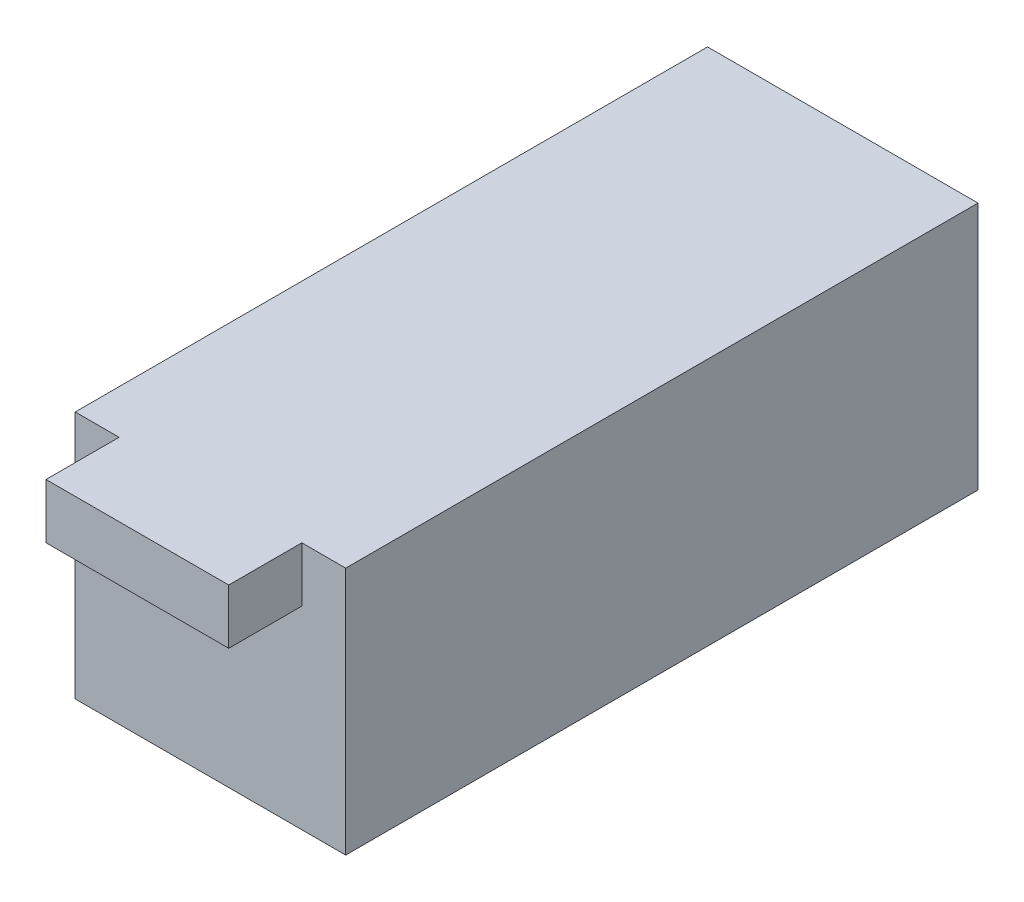
ISO-10303-21;
HEADER;
FILE_DESCRIPTION(('STEP AP214'),'2;1');
FILE_NAME('part.step','',(''),(''),'','','');
FILE_SCHEMA(('AUTOMOTIVE_DESIGN { 1 0 10303 214 1 1 1 1 }'));
ENDSEC;
DATA;
#1=APPLICATION_CONTEXT('core data for automotive mechanical design processes');
#2=APPLICATION_PROTOCOL_DEFINITION('international standard','automotive_design',2000,#1);
#3=PRODUCT_CONTEXT('',#1,'mechanical');
#4=PRODUCT('Part','Part','',(#3));
#5=PRODUCT_RELATED_PRODUCT_CATEGORY('part','',(#4));
#6=PRODUCT_DEFINITION_FORMATION('','',#4);
#7=PRODUCT_DEFINITION_CONTEXT('part definition',#1,'design');
#8=PRODUCT_DEFINITION('design','',#6,#7);
#9=PRODUCT_DEFINITION_SHAPE('','',#8);
#10=(LENGTH_UNIT() NAMED_UNIT(*) SI_UNIT(.MILLI.,.METRE.));
#11=(NAMED_UNIT(*) PLANE_ANGLE_UNIT() SI_UNIT($,.RADIAN.));
#12=(NAMED_UNIT(*) SI_UNIT($,.STERADIAN.) SOLID_ANGLE_UNIT());
#13=UNCERTAINTY_MEASURE_WITH_UNIT(LENGTH_MEASURE(1.E-05),#10,'distance_accuracy_value','');
#14=(GEOMETRIC_REPRESENTATION_CONTEXT(3) GLOBAL_UNCERTAINTY_ASSIGNED_CONTEXT((#13)) GLOBAL_UNIT_ASSIGNED_CONTEXT((#10,
#11,#12)) REPRESENTATION_CONTEXT('',''));
#15=CARTESIAN_POINT('',(0.,0.,0.));
#16=DIRECTION('',(0.,0.,1.));
#17=DIRECTION('',(1.,0.,0.));
#18=AXIS2_PLACEMENT_3D('',#15,#16,#17);
#19=CARTESIAN_POINT('',(-37.,-34.,173.));
#20=DIRECTION('',(1.,0.,0.));
#21=DIRECTION('',(0.,0.,-1.));
#22=AXIS2_PLACEMENT_3D('',#19,#20,#21);
#23=PLANE('',#22);
#24=DIRECTION('',(0.,-1.,0.));
#25=VECTOR('',#24,1.);
#26=CARTESIAN_POINT('',(-37.,-34.,0.));
#27=LINE('',#26,#25);
#28=CARTESIAN_POINT('',(-37.,34.,0.));
#29=VERTEX_POINT('',#28);
#30=CARTESIAN_POINT('',(-37.,-34.,0.));
#31=VERTEX_POINT('',#30);
#32=EDGE_CURVE('E118',#29,#31,#27,.T.);
#33=ORIENTED_EDGE('',*,*,#32,.T.);
#34=DIRECTION('',(0.,0.,-1.));
#35=VECTOR('',#34,1.);
#36=CARTESIAN_POINT('',(-37.,-34.,173.));
#37=LINE('',#36,#35);
#38=CARTESIAN_POINT('',(-37.,-34.,173.));
#39=VERTEX_POINT('',#38);
#40=EDGE_CURVE('E11',#39,#31,#37,.T.);
#41=ORIENTED_EDGE('',*,*,#40,.F.);
#42=DIRECTION('',(0.,-1.,0.));
#43=VECTOR('',#42,1.);
#44=CARTESIAN_POINT('',(-37.,-34.,173.));
#45=LINE('',#44,#43);
#46=CARTESIAN_POINT('',(-37.,34.,173.));
#47=VERTEX_POINT('',#46);
#48=EDGE_CURVE('E127',#47,#39,#45,.T.);
#49=ORIENTED_EDGE('',*,*,#48,.F.);
#50=DIRECTION('',(0.,0.,-1.));
#51=VECTOR('',#50,1.);
#52=CARTESIAN_POINT('',(-37.,34.,173.));
#53=LINE('',#52,#51);
#54=EDGE_CURVE('E143',#47,#29,#53,.T.);
#55=ORIENTED_EDGE('',*,*,#54,.T.);
#56=EDGE_LOOP('',(#33,#41,#49,#55));
#57=FACE_BOUND('',#56,.T.);
#58=ADVANCED_FACE('F32',(#57),#23,.F.);
#59=CARTESIAN_POINT('',(37.,-34.,173.));
#60=DIRECTION('',(0.,1.,0.));
#61=DIRECTION('',(-1.,0.,0.));
#62=AXIS2_PLACEMENT_3D('',#59,#60,#61);
#63=PLANE('',#62);
#64=DIRECTION('',(1.,0.,0.));
#65=VECTOR('',#64,1.);
#66=CARTESIAN_POINT('',(37.,-34.,0.));
#67=LINE('',#66,#65);
#68=CARTESIAN_POINT('',(37.,-34.,0.));
#69=VERTEX_POINT('',#68);
#70=EDGE_CURVE('E121',#31,#69,#67,.T.);
#71=ORIENTED_EDGE('',*,*,#70,.T.);
#72=DIRECTION('',(0.,0.,-1.));
#73=VECTOR('',#72,1.);
#74=CARTESIAN_POINT('',(37.,-34.,173.));
#75=LINE('',#74,#73);
#76=CARTESIAN_POINT('',(37.,-34.,173.));
#77=VERTEX_POINT('',#76);
#78=EDGE_CURVE('E40',#77,#69,#75,.T.);
#79=ORIENTED_EDGE('',*,*,#78,.F.);
#80=DIRECTION('',(1.,0.,0.));
#81=VECTOR('',#80,1.);
#82=CARTESIAN_POINT('',(37.,-34.,173.));
#83=LINE('',#82,#81);
#84=EDGE_CURVE('E130',#39,#77,#83,.T.);
#85=ORIENTED_EDGE('',*,*,#84,.F.);
#86=ORIENTED_EDGE('',*,*,#40,.T.);
#87=EDGE_LOOP('',(#71,#79,#85,#86));
#88=FACE_BOUND('',#87,.T.);
#89=ADVANCED_FACE('F156',(#88),#63,.F.);
#90=CARTESIAN_POINT('',(37.,-34.,173.));
#91=DIRECTION('',(-1.,0.,0.));
#92=DIRECTION('',(0.,0.,1.));
#93=AXIS2_PLACEMENT_3D('',#90,#91,#92);
#94=PLANE('',#93);
#95=DIRECTION('',(0.,1.,0.));
#96=VECTOR('',#95,1.);
#97=CARTESIAN_POINT('',(37.,-34.,0.));
#98=LINE('',#97,#96);
#99=CARTESIAN_POINT('',(37.,34.,0.));
#100=VERTEX_POINT('',#99);
#101=EDGE_CURVE('E153',#69,#100,#98,.T.);
#102=ORIENTED_EDGE('',*,*,#101,.T.);
#103=DIRECTION('',(0.,0.,-1.));
#104=VECTOR('',#103,1.);
#105=CARTESIAN_POINT('',(37.,34.,173.));
#106=LINE('',#105,#104);
#107=CARTESIAN_POINT('',(37.,34.,173.));
#108=VERTEX_POINT('',#107);
#109=EDGE_CURVE('E147',#108,#100,#106,.T.);
#110=ORIENTED_EDGE('',*,*,#109,.F.);
#111=DIRECTION('',(0.,1.,0.));
#112=VECTOR('',#111,1.);
#113=CARTESIAN_POINT('',(37.,-34.,173.));
#114=LINE('',#113,#112);
#115=EDGE_CURVE('E133',#77,#108,#114,.T.);
#116=ORIENTED_EDGE('',*,*,#115,.F.);
#117=ORIENTED_EDGE('',*,*,#78,.T.);
#118=EDGE_LOOP('',(#102,#110,#116,#117));
#119=FACE_BOUND('',#118,.T.);
#120=ADVANCED_FACE('F163',(#119),#94,.F.);
#121=CARTESIAN_POINT('',(37.,34.,173.));
#122=DIRECTION('',(0.,-1.,0.));
#123=DIRECTION('',(1.,0.,0.));
#124=AXIS2_PLACEMENT_3D('',#121,#122,#123);
#125=PLANE('',#124);
#126=DIRECTION('',(-1.,0.,0.));
#127=VECTOR('',#126,1.);
#128=CARTESIAN_POINT('',(37.,34.,0.));
#129=LINE('',#128,#127);
#130=EDGE_CURVE('E131',#100,#29,#129,.T.);
#131=ORIENTED_EDGE('',*,*,#130,.T.);
#132=ORIENTED_EDGE('',*,*,#54,.F.);
#133=DIRECTION('',(-1.,0.,0.));
#134=VECTOR('',#133,1.);
#135=CARTESIAN_POINT('',(37.,34.,173.));
#136=LINE('',#135,#134);
#137=CARTESIAN_POINT('',(-25.,34.,173.));
#138=VERTEX_POINT('',#137);
#139=EDGE_CURVE('E135',#138,#47,#136,.T.);
#140=ORIENTED_EDGE('',*,*,#139,.F.);
#141=DIRECTION('',(0.,0.,-1.));
#142=VECTOR('',#141,1.);
#143=CARTESIAN_POINT('',(-25.,34.,193.));
#144=LINE('',#143,#142);
#145=CARTESIAN_POINT('',(-25.,34.,193.));
#146=VERTEX_POINT('',#145);
#147=EDGE_CURVE('E174',#146,#138,#144,.T.);
#148=ORIENTED_EDGE('',*,*,#147,.F.);
#149=DIRECTION('',(-1.,0.,0.));
#150=VECTOR('',#149,1.);
#151=CARTESIAN_POINT('',(-25.,34.,193.));
#152=LINE('',#151,#150);
#153=CARTESIAN_POINT('',(25.,34.,193.));
#154=VERTEX_POINT('',#153);
#155=EDGE_CURVE('E111',#154,#146,#152,.T.);
#156=ORIENTED_EDGE('',*,*,#155,.F.);
#157=DIRECTION('',(0.,0.,-1.));
#158=VECTOR('',#157,1.);
#159=CARTESIAN_POINT('',(25.,34.,193.));
#160=LINE('',#159,#158);
#161=CARTESIAN_POINT('',(25.,34.,173.));
#162=VERTEX_POINT('',#161);
#163=EDGE_CURVE('E123',#154,#162,#160,.T.);
#164=ORIENTED_EDGE('',*,*,#163,.T.);
#165=EDGE_CURVE('E142',#108,#162,#136,.T.);
#166=ORIENTED_EDGE('',*,*,#165,.F.);
#167=ORIENTED_EDGE('',*,*,#109,.T.);
#168=EDGE_LOOP('',(#131,#132,#140,#148,#156,#164,#166,#167));
#169=FACE_BOUND('',#168,.T.);
#170=ADVANCED_FACE('F169',(#169),#125,.F.);
#171=CARTESIAN_POINT('',(0.,0.,173.));
#172=DIRECTION('',(0.,0.,1.));
#173=DIRECTION('',(1.,0.,0.));
#174=AXIS2_PLACEMENT_3D('',#171,#172,#173);
#175=PLANE('',#174);
#176=DIRECTION('',(0.,-1.,0.));
#177=VECTOR('',#176,1.);
#178=CARTESIAN_POINT('',(-25.,34.,173.));
#179=LINE('',#178,#177);
#180=CARTESIAN_POINT('',(-25.,19.,173.));
#181=VERTEX_POINT('',#180);
#182=EDGE_CURVE('E53',#138,#181,#179,.T.);
#183=ORIENTED_EDGE('',*,*,#182,.F.);
#184=ORIENTED_EDGE('',*,*,#139,.T.);
#185=ORIENTED_EDGE('',*,*,#48,.T.);
#186=ORIENTED_EDGE('',*,*,#84,.T.);
#187=ORIENTED_EDGE('',*,*,#115,.T.);
#188=ORIENTED_EDGE('',*,*,#165,.T.);
#189=DIRECTION('',(0.,1.,0.));
#190=VECTOR('',#189,1.);
#191=CARTESIAN_POINT('',(25.,34.,173.));
#192=LINE('',#191,#190);
#193=CARTESIAN_POINT('',(25.,19.,173.));
#194=VERTEX_POINT('',#193);
#195=EDGE_CURVE('E115',#194,#162,#192,.T.);
#196=ORIENTED_EDGE('',*,*,#195,.F.);
#197=DIRECTION('',(1.,0.,0.));
#198=VECTOR('',#197,1.);
#199=CARTESIAN_POINT('',(-25.,19.,173.));
#200=LINE('',#199,#198);
#201=EDGE_CURVE('E48',#181,#194,#200,.T.);
#202=ORIENTED_EDGE('',*,*,#201,.F.);
#203=EDGE_LOOP('',(#183,#184,#185,#186,#187,#188,#196,#202));
#204=FACE_BOUND('',#203,.T.);
#205=ADVANCED_FACE('F173',(#204),#175,.T.);
#206=CARTESIAN_POINT('',(0.,0.,0.));
#207=DIRECTION('',(0.,0.,1.));
#208=DIRECTION('',(1.,0.,0.));
#209=AXIS2_PLACEMENT_3D('',#206,#207,#208);
#210=PLANE('',#209);
#211=ORIENTED_EDGE('',*,*,#32,.F.);
#212=ORIENTED_EDGE('',*,*,#130,.F.);
#213=ORIENTED_EDGE('',*,*,#101,.F.);
#214=ORIENTED_EDGE('',*,*,#70,.F.);
#215=EDGE_LOOP('',(#211,#212,#213,#214));
#216=FACE_BOUND('',#215,.T.);
#217=ADVANCED_FACE('F166',(#216),#210,.F.);
#218=CARTESIAN_POINT('',(-25.,34.,193.));
#219=DIRECTION('',(1.,0.,0.));
#220=DIRECTION('',(0.,1.,0.));
#221=AXIS2_PLACEMENT_3D('',#218,#219,#220);
#222=PLANE('',#221);
#223=ORIENTED_EDGE('',*,*,#182,.T.);
#224=DIRECTION('',(0.,0.,-1.));
#225=VECTOR('',#224,1.);
#226=CARTESIAN_POINT('',(-25.,19.,193.));
#227=LINE('',#226,#225);
#228=CARTESIAN_POINT('',(-25.,19.,193.));
#229=VERTEX_POINT('',#228);
#230=EDGE_CURVE('E100',#229,#181,#227,.T.);
#231=ORIENTED_EDGE('',*,*,#230,.F.);
#232=DIRECTION('',(0.,-1.,0.));
#233=VECTOR('',#232,1.);
#234=CARTESIAN_POINT('',(-25.,34.,193.));
#235=LINE('',#234,#233);
#236=EDGE_CURVE('E106',#146,#229,#235,.T.);
#237=ORIENTED_EDGE('',*,*,#236,.F.);
#238=ORIENTED_EDGE('',*,*,#147,.T.);
#239=EDGE_LOOP('',(#223,#231,#237,#238));
#240=FACE_BOUND('',#239,.T.);
#241=ADVANCED_FACE('F117',(#240),#222,.F.);
#242=CARTESIAN_POINT('',(-25.,19.,193.));
#243=DIRECTION('',(0.,1.,0.));
#244=DIRECTION('',(-1.,0.,0.));
#245=AXIS2_PLACEMENT_3D('',#242,#243,#244);
#246=PLANE('',#245);
#247=ORIENTED_EDGE('',*,*,#201,.T.);
#248=DIRECTION('',(0.,0.,-1.));
#249=VECTOR('',#248,1.);
#250=CARTESIAN_POINT('',(25.,19.,193.));
#251=LINE('',#250,#249);
#252=CARTESIAN_POINT('',(25.,19.,193.));
#253=VERTEX_POINT('',#252);
#254=EDGE_CURVE('E102',#253,#194,#251,.T.);
#255=ORIENTED_EDGE('',*,*,#254,.F.);
#256=DIRECTION('',(1.,0.,0.));
#257=VECTOR('',#256,1.);
#258=CARTESIAN_POINT('',(-25.,19.,193.));
#259=LINE('',#258,#257);
#260=EDGE_CURVE('E96',#229,#253,#259,.T.);
#261=ORIENTED_EDGE('',*,*,#260,.F.);
#262=ORIENTED_EDGE('',*,*,#230,.T.);
#263=EDGE_LOOP('',(#247,#255,#261,#262));
#264=FACE_BOUND('',#263,.T.);
#265=ADVANCED_FACE('F98',(#264),#246,.F.);
#266=CARTESIAN_POINT('',(25.,34.,193.));
#267=DIRECTION('',(-1.,0.,0.));
#268=DIRECTION('',(0.,-1.,0.));
#269=AXIS2_PLACEMENT_3D('',#266,#267,#268);
#270=PLANE('',#269);
#271=ORIENTED_EDGE('',*,*,#195,.T.);
#272=ORIENTED_EDGE('',*,*,#163,.F.);
#273=DIRECTION('',(0.,1.,0.));
#274=VECTOR('',#273,1.);
#275=CARTESIAN_POINT('',(25.,34.,193.));
#276=LINE('',#275,#274);
#277=EDGE_CURVE('E105',#253,#154,#276,.T.);
#278=ORIENTED_EDGE('',*,*,#277,.F.);
#279=ORIENTED_EDGE('',*,*,#254,.T.);
#280=EDGE_LOOP('',(#271,#272,#278,#279));
#281=FACE_BOUND('',#280,.T.);
#282=ADVANCED_FACE('F189',(#281),#270,.F.);
#283=CARTESIAN_POINT('',(0.,0.,193.));
#284=DIRECTION('',(0.,0.,1.));
#285=DIRECTION('',(1.,0.,0.));
#286=AXIS2_PLACEMENT_3D('',#283,#284,#285);
#287=PLANE('',#286);
#288=ORIENTED_EDGE('',*,*,#236,.T.);
#289=ORIENTED_EDGE('',*,*,#260,.T.);
#290=ORIENTED_EDGE('',*,*,#277,.T.);
#291=ORIENTED_EDGE('',*,*,#155,.T.);
#292=EDGE_LOOP('',(#288,#289,#290,#291));
#293=FACE_BOUND('',#292,.T.);
#294=ADVANCED_FACE('F109',(#293),#287,.T.);
#295=CLOSED_SHELL('',(#58,#89,#120,#170,#205,#217,#241,#265,#282,#294));
#296=MANIFOLD_SOLID_BREP('B2',#295);
#297=ADVANCED_BREP_SHAPE_REPRESENTATION('',(#18,#296),#14);
#298=SHAPE_DEFINITION_REPRESENTATION(#9,#297);
ENDSEC;
END-ISO-10303-21;
